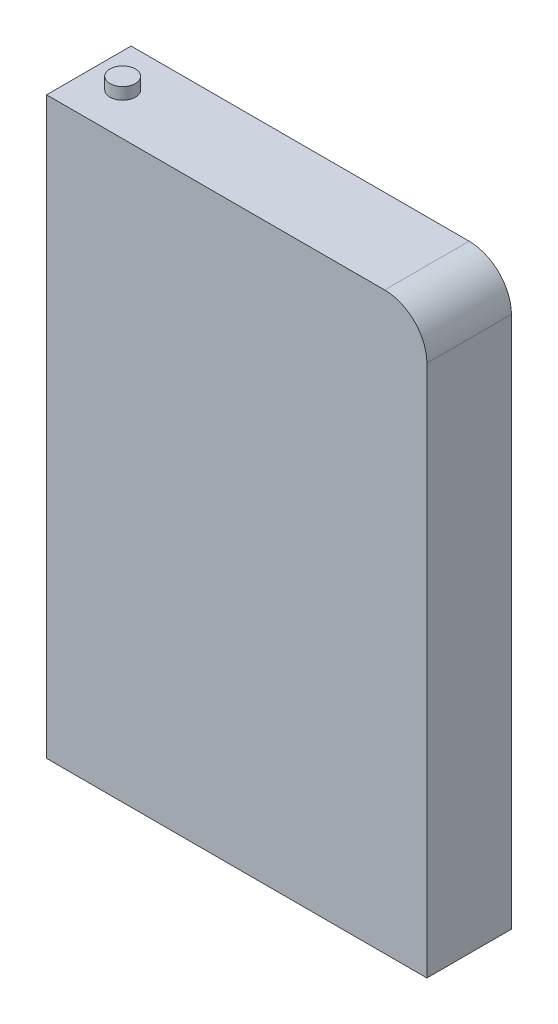
ISO-10303-21;
HEADER;
FILE_DESCRIPTION(('STEP AP214'),'2;1');
FILE_NAME('part.step','',(''),(''),'','','');
FILE_SCHEMA(('AUTOMOTIVE_DESIGN { 1 0 10303 214 1 1 1 1 }'));
ENDSEC;
DATA;
#1=APPLICATION_CONTEXT('core data for automotive mechanical design processes');
#2=APPLICATION_PROTOCOL_DEFINITION('international standard','automotive_design',2000,#1);
#3=PRODUCT_CONTEXT('',#1,'mechanical');
#4=PRODUCT('Part','Part','',(#3));
#5=PRODUCT_RELATED_PRODUCT_CATEGORY('part','',(#4));
#6=PRODUCT_DEFINITION_FORMATION('','',#4);
#7=PRODUCT_DEFINITION_CONTEXT('part definition',#1,'design');
#8=PRODUCT_DEFINITION('design','',#6,#7);
#9=PRODUCT_DEFINITION_SHAPE('','',#8);
#10=(LENGTH_UNIT() NAMED_UNIT(*) SI_UNIT(.MILLI.,.METRE.));
#11=(NAMED_UNIT(*) PLANE_ANGLE_UNIT() SI_UNIT($,.RADIAN.));
#12=(NAMED_UNIT(*) SI_UNIT($,.STERADIAN.) SOLID_ANGLE_UNIT());
#13=UNCERTAINTY_MEASURE_WITH_UNIT(LENGTH_MEASURE(1.E-05),#10,'distance_accuracy_value','');
#14=(GEOMETRIC_REPRESENTATION_CONTEXT(3) GLOBAL_UNCERTAINTY_ASSIGNED_CONTEXT((#13)) GLOBAL_UNIT_ASSIGNED_CONTEXT((#10,
#11,#12)) REPRESENTATION_CONTEXT('',''));
#15=CARTESIAN_POINT('',(0.,0.,0.));
#16=DIRECTION('',(0.,0.,1.));
#17=DIRECTION('',(1.,0.,0.));
#18=AXIS2_PLACEMENT_3D('',#15,#16,#17);
#19=CARTESIAN_POINT('',(22.5,-34.,10.));
#20=DIRECTION('',(-1.,0.,0.));
#21=DIRECTION('',(0.,0.,1.));
#22=AXIS2_PLACEMENT_3D('',#19,#20,#21);
#23=PLANE('',#22);
#24=DIRECTION('',(0.,1.,0.));
#25=VECTOR('',#24,1.);
#26=CARTESIAN_POINT('',(22.5,-34.,0.));
#27=LINE('',#26,#25);
#28=CARTESIAN_POINT('',(22.5,-34.,0.));
#29=VERTEX_POINT('',#28);
#30=CARTESIAN_POINT('',(22.5,29.,0.));
#31=VERTEX_POINT('',#30);
#32=EDGE_CURVE('E62',#29,#31,#27,.T.);
#33=ORIENTED_EDGE('',*,*,#32,.T.);
#34=DIRECTION('',(0.,0.,-1.));
#35=VECTOR('',#34,1.);
#36=CARTESIAN_POINT('',(22.5,29.,10.));
#37=LINE('',#36,#35);
#38=CARTESIAN_POINT('',(22.5,29.,10.));
#39=VERTEX_POINT('',#38);
#40=EDGE_CURVE('E128',#31,#39,#37,.F.);
#41=ORIENTED_EDGE('',*,*,#40,.T.);
#42=DIRECTION('',(0.,1.,0.));
#43=VECTOR('',#42,1.);
#44=CARTESIAN_POINT('',(22.5,-34.,10.));
#45=LINE('',#44,#43);
#46=CARTESIAN_POINT('',(22.5,-34.,10.));
#47=VERTEX_POINT('',#46);
#48=EDGE_CURVE('E55',#47,#39,#45,.T.);
#49=ORIENTED_EDGE('',*,*,#48,.F.);
#50=DIRECTION('',(0.,0.,-1.));
#51=VECTOR('',#50,1.);
#52=CARTESIAN_POINT('',(22.5,-34.,10.));
#53=LINE('',#52,#51);
#54=EDGE_CURVE('E112',#47,#29,#53,.T.);
#55=ORIENTED_EDGE('',*,*,#54,.T.);
#56=EDGE_LOOP('',(#33,#41,#49,#55));
#57=FACE_BOUND('',#56,.T.);
#58=ADVANCED_FACE('F40',(#57),#23,.F.);
#59=CARTESIAN_POINT('',(-22.5,34.,10.));
#60=DIRECTION('',(0.,-1.,0.));
#61=DIRECTION('',(0.,0.,-1.));
#62=AXIS2_PLACEMENT_3D('',#59,#60,#61);
#63=PLANE('',#62);
#64=CARTESIAN_POINT('',(-18.5,34.,5.));
#65=DIRECTION('',(0.,-1.,0.));
#66=DIRECTION('',(0.,0.,-1.));
#67=AXIS2_PLACEMENT_3D('',#64,#65,#66);
#68=CIRCLE('',#67,1.5);
#69=CARTESIAN_POINT('',(-18.5,34.,3.5));
#70=VERTEX_POINT('',#69);
#71=EDGE_CURVE('E12',#70,#70,#68,.F.);
#72=ORIENTED_EDGE('',*,*,#71,.F.);
#73=EDGE_LOOP('',(#72));
#74=FACE_BOUND('',#73,.T.);
#75=DIRECTION('',(-1.,0.,0.));
#76=VECTOR('',#75,1.);
#77=CARTESIAN_POINT('',(-22.5,34.,10.));
#78=LINE('',#77,#76);
#79=CARTESIAN_POINT('',(17.5,34.,10.));
#80=VERTEX_POINT('',#79);
#81=CARTESIAN_POINT('',(-22.5,34.,10.));
#82=VERTEX_POINT('',#81);
#83=EDGE_CURVE('E86',#80,#82,#78,.T.);
#84=ORIENTED_EDGE('',*,*,#83,.F.);
#85=DIRECTION('',(0.,0.,-1.));
#86=VECTOR('',#85,1.);
#87=CARTESIAN_POINT('',(17.5,34.,10.));
#88=LINE('',#87,#86);
#89=CARTESIAN_POINT('',(17.5,34.,0.));
#90=VERTEX_POINT('',#89);
#91=EDGE_CURVE('E104',#80,#90,#88,.T.);
#92=ORIENTED_EDGE('',*,*,#91,.T.);
#93=DIRECTION('',(-1.,0.,0.));
#94=VECTOR('',#93,1.);
#95=CARTESIAN_POINT('',(-22.5,34.,0.));
#96=LINE('',#95,#94);
#97=CARTESIAN_POINT('',(-22.5,34.,0.));
#98=VERTEX_POINT('',#97);
#99=EDGE_CURVE('E101',#90,#98,#96,.T.);
#100=ORIENTED_EDGE('',*,*,#99,.T.);
#101=DIRECTION('',(0.,0.,-1.));
#102=VECTOR('',#101,1.);
#103=CARTESIAN_POINT('',(-22.5,34.,10.));
#104=LINE('',#103,#102);
#105=EDGE_CURVE('E98',#82,#98,#104,.T.);
#106=ORIENTED_EDGE('',*,*,#105,.F.);
#107=EDGE_LOOP('',(#84,#92,#100,#106));
#108=FACE_BOUND('',#107,.T.);
#109=ADVANCED_FACE('F99',(#74,#108),#63,.F.);
#110=CARTESIAN_POINT('',(-22.5,-34.,10.));
#111=DIRECTION('',(1.,0.,0.));
#112=DIRECTION('',(0.,0.,-1.));
#113=AXIS2_PLACEMENT_3D('',#110,#111,#112);
#114=PLANE('',#113);
#115=DIRECTION('',(0.,0.,-1.));
#116=VECTOR('',#115,1.);
#117=CARTESIAN_POINT('',(-22.5,-34.,10.));
#118=LINE('',#117,#116);
#119=CARTESIAN_POINT('',(-22.5,-34.,10.));
#120=VERTEX_POINT('',#119);
#121=CARTESIAN_POINT('',(-22.5,-34.,0.));
#122=VERTEX_POINT('',#121);
#123=EDGE_CURVE('E105',#120,#122,#118,.T.);
#124=ORIENTED_EDGE('',*,*,#123,.F.);
#125=DIRECTION('',(0.,-1.,0.));
#126=VECTOR('',#125,1.);
#127=CARTESIAN_POINT('',(-22.5,-34.,10.));
#128=LINE('',#127,#126);
#129=EDGE_CURVE('E90',#82,#120,#128,.T.);
#130=ORIENTED_EDGE('',*,*,#129,.F.);
#131=ORIENTED_EDGE('',*,*,#105,.T.);
#132=DIRECTION('',(0.,-1.,0.));
#133=VECTOR('',#132,1.);
#134=CARTESIAN_POINT('',(-22.5,-34.,0.));
#135=LINE('',#134,#133);
#136=EDGE_CURVE('E119',#98,#122,#135,.T.);
#137=ORIENTED_EDGE('',*,*,#136,.T.);
#138=EDGE_LOOP('',(#124,#130,#131,#137));
#139=FACE_BOUND('',#138,.T.);
#140=ADVANCED_FACE('F107',(#139),#114,.F.);
#141=CARTESIAN_POINT('',(-22.5,-34.,10.));
#142=DIRECTION('',(0.,1.,0.));
#143=DIRECTION('',(0.,0.,1.));
#144=AXIS2_PLACEMENT_3D('',#141,#142,#143);
#145=PLANE('',#144);
#146=CARTESIAN_POINT('',(-18.5,-34.,5.));
#147=DIRECTION('',(0.,-1.,0.));
#148=DIRECTION('',(0.,0.,-1.));
#149=AXIS2_PLACEMENT_3D('',#146,#147,#148);
#150=CIRCLE('',#149,2.5);
#151=CARTESIAN_POINT('',(-18.5,-34.,2.5));
#152=VERTEX_POINT('',#151);
#153=EDGE_CURVE('E240',#152,#152,#150,.T.);
#154=ORIENTED_EDGE('',*,*,#153,.F.);
#155=EDGE_LOOP('',(#154));
#156=FACE_BOUND('',#155,.T.);
#157=DIRECTION('',(1.,0.,0.));
#158=VECTOR('',#157,1.);
#159=CARTESIAN_POINT('',(-22.5,-34.,0.));
#160=LINE('',#159,#158);
#161=EDGE_CURVE('E121',#122,#29,#160,.T.);
#162=ORIENTED_EDGE('',*,*,#161,.T.);
#163=ORIENTED_EDGE('',*,*,#54,.F.);
#164=DIRECTION('',(1.,0.,0.));
#165=VECTOR('',#164,1.);
#166=CARTESIAN_POINT('',(-22.5,-34.,10.));
#167=LINE('',#166,#165);
#168=EDGE_CURVE('E110',#120,#47,#167,.T.);
#169=ORIENTED_EDGE('',*,*,#168,.F.);
#170=ORIENTED_EDGE('',*,*,#123,.T.);
#171=EDGE_LOOP('',(#162,#163,#169,#170));
#172=FACE_BOUND('',#171,.T.);
#173=ADVANCED_FACE('F135',(#156,#172),#145,.F.);
#174=CARTESIAN_POINT('',(0.,0.,10.));
#175=DIRECTION('',(0.,0.,-1.));
#176=DIRECTION('',(-1.,0.,0.));
#177=AXIS2_PLACEMENT_3D('',#174,#175,#176);
#178=PLANE('',#177);
#179=ORIENTED_EDGE('',*,*,#48,.T.);
#180=CARTESIAN_POINT('',(17.5,29.,10.));
#181=DIRECTION('',(0.,0.,-1.));
#182=DIRECTION('',(-1.,0.,0.));
#183=AXIS2_PLACEMENT_3D('',#180,#181,#182);
#184=CIRCLE('',#183,5.);
#185=EDGE_CURVE('E48',#39,#80,#184,.F.);
#186=ORIENTED_EDGE('',*,*,#185,.T.);
#187=ORIENTED_EDGE('',*,*,#83,.T.);
#188=ORIENTED_EDGE('',*,*,#129,.T.);
#189=ORIENTED_EDGE('',*,*,#168,.T.);
#190=EDGE_LOOP('',(#179,#186,#187,#188,#189));
#191=FACE_BOUND('',#190,.T.);
#192=ADVANCED_FACE('F88',(#191),#178,.F.);
#193=CARTESIAN_POINT('',(0.,0.,0.));
#194=DIRECTION('',(0.,0.,-1.));
#195=DIRECTION('',(-1.,0.,0.));
#196=AXIS2_PLACEMENT_3D('',#193,#194,#195);
#197=PLANE('',#196);
#198=ORIENTED_EDGE('',*,*,#161,.F.);
#199=ORIENTED_EDGE('',*,*,#136,.F.);
#200=ORIENTED_EDGE('',*,*,#99,.F.);
#201=CARTESIAN_POINT('',(17.5,29.,0.));
#202=DIRECTION('',(0.,0.,-1.));
#203=DIRECTION('',(-1.,0.,0.));
#204=AXIS2_PLACEMENT_3D('',#201,#202,#203);
#205=CIRCLE('',#204,5.);
#206=EDGE_CURVE('E126',#90,#31,#205,.T.);
#207=ORIENTED_EDGE('',*,*,#206,.T.);
#208=ORIENTED_EDGE('',*,*,#32,.F.);
#209=EDGE_LOOP('',(#198,#199,#200,#207,#208));
#210=FACE_BOUND('',#209,.T.);
#211=ADVANCED_FACE('F133',(#210),#197,.T.);
#212=CARTESIAN_POINT('',(17.5,29.,10.));
#213=DIRECTION('',(0.,0.,-1.));
#214=DIRECTION('',(-1.,0.,0.));
#215=AXIS2_PLACEMENT_3D('',#212,#213,#214);
#216=CYLINDRICAL_SURFACE('',#215,5.);
#217=ORIENTED_EDGE('',*,*,#185,.F.);
#218=ORIENTED_EDGE('',*,*,#40,.F.);
#219=ORIENTED_EDGE('',*,*,#206,.F.);
#220=ORIENTED_EDGE('',*,*,#91,.F.);
#221=EDGE_LOOP('',(#217,#218,#219,#220));
#222=FACE_BOUND('',#221,.T.);
#223=ADVANCED_FACE('F42',(#222),#216,.T.);
#224=CARTESIAN_POINT('',(-18.5,35.4,5.));
#225=DIRECTION('',(0.,-1.,0.));
#226=DIRECTION('',(0.,0.,-1.));
#227=AXIS2_PLACEMENT_3D('',#224,#225,#226);
#228=CYLINDRICAL_SURFACE('',#227,1.5);
#229=CARTESIAN_POINT('',(-18.5,35.4,5.));
#230=DIRECTION('',(0.,1.,0.));
#231=DIRECTION('',(0.,0.,1.));
#232=AXIS2_PLACEMENT_3D('',#229,#230,#231);
#233=CIRCLE('',#232,1.5);
#234=CARTESIAN_POINT('',(-18.5,35.4,6.5));
#235=VERTEX_POINT('',#234);
#236=EDGE_CURVE('E117',#235,#235,#233,.T.);
#237=ORIENTED_EDGE('',*,*,#236,.F.);
#238=EDGE_LOOP('',(#237));
#239=FACE_BOUND('',#238,.T.);
#240=ORIENTED_EDGE('',*,*,#71,.T.);
#241=EDGE_LOOP('',(#240));
#242=FACE_BOUND('',#241,.T.);
#243=ADVANCED_FACE('F161',(#239,#242),#228,.T.);
#244=CARTESIAN_POINT('',(-18.5,35.4,5.));
#245=DIRECTION('',(0.,1.,0.));
#246=DIRECTION('',(0.,0.,1.));
#247=AXIS2_PLACEMENT_3D('',#244,#245,#246);
#248=PLANE('',#247);
#249=ORIENTED_EDGE('',*,*,#236,.T.);
#250=EDGE_LOOP('',(#249));
#251=FACE_BOUND('',#250,.T.);
#252=ADVANCED_FACE('F162',(#251),#248,.T.);
#253=CARTESIAN_POINT('',(-18.5,-29.,5.));
#254=DIRECTION('',(0.,-1.,0.));
#255=DIRECTION('',(0.,0.,-1.));
#256=AXIS2_PLACEMENT_3D('',#253,#254,#255);
#257=CYLINDRICAL_SURFACE('',#256,2.5);
#258=CARTESIAN_POINT('',(-18.5,-29.,5.));
#259=DIRECTION('',(0.,-1.,0.));
#260=DIRECTION('',(0.,0.,-1.));
#261=AXIS2_PLACEMENT_3D('',#258,#259,#260);
#262=CIRCLE('',#261,2.5);
#263=CARTESIAN_POINT('',(-18.5,-29.,2.5));
#264=VERTEX_POINT('',#263);
#265=EDGE_CURVE('E239',#264,#264,#262,.T.);
#266=ORIENTED_EDGE('',*,*,#265,.F.);
#267=EDGE_LOOP('',(#266));
#268=FACE_BOUND('',#267,.T.);
#269=ORIENTED_EDGE('',*,*,#153,.T.);
#270=EDGE_LOOP('',(#269));
#271=FACE_BOUND('',#270,.T.);
#272=ADVANCED_FACE('F167',(#268,#271),#257,.F.);
#273=CARTESIAN_POINT('',(-18.5,-29.,5.));
#274=DIRECTION('',(0.,-1.,0.));
#275=DIRECTION('',(0.,0.,-1.));
#276=AXIS2_PLACEMENT_3D('',#273,#274,#275);
#277=PLANE('',#276);
#278=ORIENTED_EDGE('',*,*,#265,.T.);
#279=EDGE_LOOP('',(#278));
#280=FACE_BOUND('',#279,.T.);
#281=ADVANCED_FACE('F185',(#280),#277,.T.);
#282=CLOSED_SHELL('',(#58,#109,#140,#173,#192,#211,#223,#243,#252,#272,#281));
#283=MANIFOLD_SOLID_BREP('B2',#282);
#284=ADVANCED_BREP_SHAPE_REPRESENTATION('',(#18,#283),#14);
#285=SHAPE_DEFINITION_REPRESENTATION(#9,#284);
ENDSEC;
END-ISO-10303-21;
